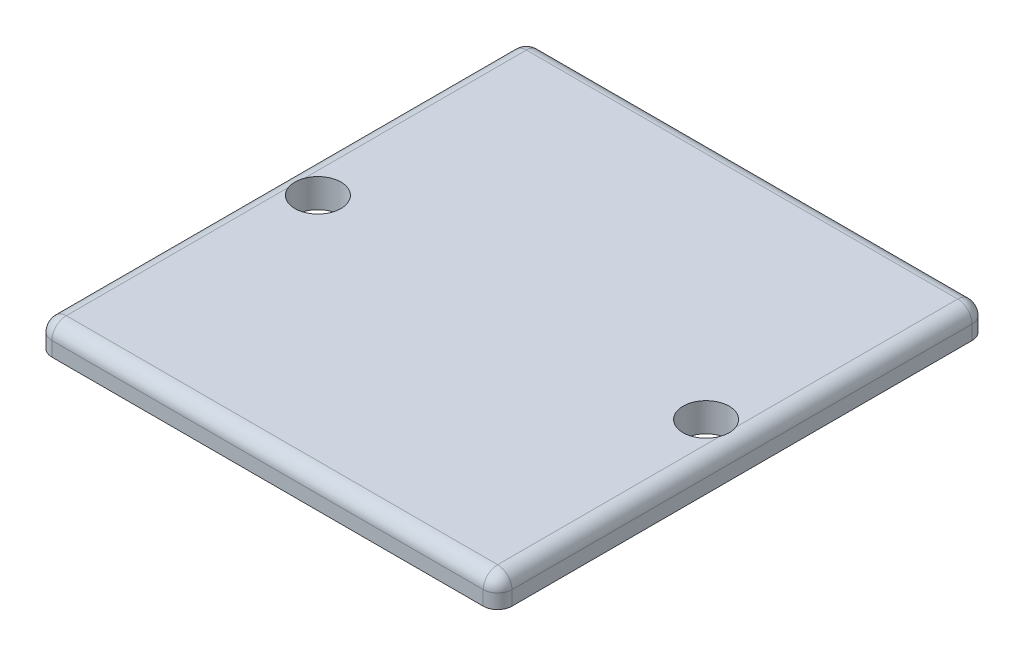
ISO-10303-21;
HEADER;
FILE_DESCRIPTION(('STEP AP214'),'2;1');
FILE_NAME('part.step','',(''),(''),'','','');
FILE_SCHEMA(('AUTOMOTIVE_DESIGN { 1 0 10303 214 1 1 1 1 }'));
ENDSEC;
DATA;
#1=APPLICATION_CONTEXT('core data for automotive mechanical design processes');
#2=APPLICATION_PROTOCOL_DEFINITION('international standard','automotive_design',2000,#1);
#3=PRODUCT_CONTEXT('',#1,'mechanical');
#4=PRODUCT('Part','Part','',(#3));
#5=PRODUCT_RELATED_PRODUCT_CATEGORY('part','',(#4));
#6=PRODUCT_DEFINITION_FORMATION('','',#4);
#7=PRODUCT_DEFINITION_CONTEXT('part definition',#1,'design');
#8=PRODUCT_DEFINITION('design','',#6,#7);
#9=PRODUCT_DEFINITION_SHAPE('','',#8);
#10=(LENGTH_UNIT() NAMED_UNIT(*) SI_UNIT(.MILLI.,.METRE.));
#11=(NAMED_UNIT(*) PLANE_ANGLE_UNIT() SI_UNIT($,.RADIAN.));
#12=(NAMED_UNIT(*) SI_UNIT($,.STERADIAN.) SOLID_ANGLE_UNIT());
#13=UNCERTAINTY_MEASURE_WITH_UNIT(LENGTH_MEASURE(1.E-05),#10,'distance_accuracy_value','');
#14=(GEOMETRIC_REPRESENTATION_CONTEXT(3) GLOBAL_UNCERTAINTY_ASSIGNED_CONTEXT((#13)) GLOBAL_UNIT_ASSIGNED_CONTEXT((#10,
#11,#12)) REPRESENTATION_CONTEXT('',''));
#15=CARTESIAN_POINT('',(0.,0.,0.));
#16=DIRECTION('',(0.,0.,1.));
#17=DIRECTION('',(1.,0.,0.));
#18=AXIS2_PLACEMENT_3D('',#15,#16,#17);
#19=CARTESIAN_POINT('',(0.,2.,0.));
#20=DIRECTION('',(0.,-1.,0.));
#21=DIRECTION('',(0.,0.,-1.));
#22=AXIS2_PLACEMENT_3D('',#19,#20,#21);
#23=PLANE('',#22);
#24=CARTESIAN_POINT('',(13.5,2.,0.));
#25=DIRECTION('',(0.,1.,0.));
#26=DIRECTION('',(0.,0.,-1.));
#27=AXIS2_PLACEMENT_3D('',#24,#25,#26);
#28=CIRCLE('',#27,1.6);
#29=CARTESIAN_POINT('',(15.,2.,-0.556776436283016));
#30=VERTEX_POINT('',#29);
#31=CARTESIAN_POINT('',(15.,2.,0.55677643628301));
#32=VERTEX_POINT('',#31);
#33=EDGE_CURVE('E362',#30,#32,#28,.T.);
#34=ORIENTED_EDGE('',*,*,#33,.F.);
#35=DIRECTION('',(0.,0.,-1.));
#36=VECTOR('',#35,1.);
#37=CARTESIAN_POINT('',(15.,2.,0.));
#38=LINE('',#37,#36);
#39=CARTESIAN_POINT('',(15.,2.,-16.));
#40=VERTEX_POINT('',#39);
#41=EDGE_CURVE('E230',#30,#40,#38,.T.);
#42=ORIENTED_EDGE('',*,*,#41,.T.);
#43=DIRECTION('',(-1.,0.,0.));
#44=VECTOR('',#43,1.);
#45=CARTESIAN_POINT('',(0.,2.,-16.));
#46=LINE('',#45,#44);
#47=CARTESIAN_POINT('',(-15.,2.,-16.));
#48=VERTEX_POINT('',#47);
#49=EDGE_CURVE('E135',#40,#48,#46,.T.);
#50=ORIENTED_EDGE('',*,*,#49,.T.);
#51=DIRECTION('',(0.,0.,1.));
#52=VECTOR('',#51,1.);
#53=CARTESIAN_POINT('',(-15.,2.,0.));
#54=LINE('',#53,#52);
#55=CARTESIAN_POINT('',(-15.,2.,-0.556776436283004));
#56=VERTEX_POINT('',#55);
#57=EDGE_CURVE('E129',#48,#56,#54,.T.);
#58=ORIENTED_EDGE('',*,*,#57,.T.);
#59=CARTESIAN_POINT('',(-13.5,2.,0.));
#60=DIRECTION('',(0.,1.,0.));
#61=DIRECTION('',(0.,0.,1.));
#62=AXIS2_PLACEMENT_3D('',#59,#60,#61);
#63=CIRCLE('',#62,1.6);
#64=CARTESIAN_POINT('',(-15.,2.,0.556776436283004));
#65=VERTEX_POINT('',#64);
#66=EDGE_CURVE('E132',#65,#56,#63,.T.);
#67=ORIENTED_EDGE('',*,*,#66,.F.);
#68=DIRECTION('',(0.,0.,1.));
#69=VECTOR('',#68,1.);
#70=CARTESIAN_POINT('',(-15.,2.,0.));
#71=LINE('',#70,#69);
#72=CARTESIAN_POINT('',(-15.,2.,16.));
#73=VERTEX_POINT('',#72);
#74=EDGE_CURVE('E153',#65,#73,#71,.T.);
#75=ORIENTED_EDGE('',*,*,#74,.T.);
#76=DIRECTION('',(1.,0.,0.));
#77=VECTOR('',#76,1.);
#78=CARTESIAN_POINT('',(0.,2.,16.));
#79=LINE('',#78,#77);
#80=CARTESIAN_POINT('',(15.,2.,16.));
#81=VERTEX_POINT('',#80);
#82=EDGE_CURVE('E377',#73,#81,#79,.T.);
#83=ORIENTED_EDGE('',*,*,#82,.T.);
#84=DIRECTION('',(0.,0.,-1.));
#85=VECTOR('',#84,1.);
#86=CARTESIAN_POINT('',(15.,2.,0.));
#87=LINE('',#86,#85);
#88=EDGE_CURVE('E141',#81,#32,#87,.T.);
#89=ORIENTED_EDGE('',*,*,#88,.T.);
#90=EDGE_LOOP('',(#34,#42,#50,#58,#67,#75,#83,#89));
#91=FACE_BOUND('',#90,.T.);
#92=ADVANCED_FACE('F39',(#91),#23,.F.);
#93=CARTESIAN_POINT('',(0.,0.,0.));
#94=DIRECTION('',(0.,-1.,0.));
#95=DIRECTION('',(0.,0.,-1.));
#96=AXIS2_PLACEMENT_3D('',#93,#94,#95);
#97=PLANE('',#96);
#98=CARTESIAN_POINT('',(-13.5,0.,0.));
#99=DIRECTION('',(0.,1.,0.));
#100=DIRECTION('',(0.,0.,1.));
#101=AXIS2_PLACEMENT_3D('',#98,#99,#100);
#102=CIRCLE('',#101,1.6);
#103=CARTESIAN_POINT('',(-13.5,0.,1.6));
#104=VERTEX_POINT('',#103);
#105=EDGE_CURVE('E149',#104,#104,#102,.T.);
#106=ORIENTED_EDGE('',*,*,#105,.T.);
#107=EDGE_LOOP('',(#106));
#108=FACE_BOUND('',#107,.T.);
#109=DIRECTION('',(0.,0.,1.));
#110=VECTOR('',#109,1.);
#111=CARTESIAN_POINT('',(-16.,0.,17.));
#112=LINE('',#111,#110);
#113=CARTESIAN_POINT('',(-16.,0.,-16.));
#114=VERTEX_POINT('',#113);
#115=CARTESIAN_POINT('',(-16.,0.,16.));
#116=VERTEX_POINT('',#115);
#117=EDGE_CURVE('E275',#114,#116,#112,.T.);
#118=ORIENTED_EDGE('',*,*,#117,.F.);
#119=CARTESIAN_POINT('',(-15.,0.,-16.));
#120=DIRECTION('',(0.,-1.,0.));
#121=DIRECTION('',(0.,0.,-1.));
#122=AXIS2_PLACEMENT_3D('',#119,#120,#121);
#123=CIRCLE('',#122,1.);
#124=CARTESIAN_POINT('',(-15.,0.,-17.));
#125=VERTEX_POINT('',#124);
#126=EDGE_CURVE('E11',#114,#125,#123,.T.);
#127=ORIENTED_EDGE('',*,*,#126,.T.);
#128=DIRECTION('',(-1.,0.,0.));
#129=VECTOR('',#128,1.);
#130=CARTESIAN_POINT('',(-16.,0.,-17.));
#131=LINE('',#130,#129);
#132=CARTESIAN_POINT('',(15.,0.,-17.));
#133=VERTEX_POINT('',#132);
#134=EDGE_CURVE('E267',#133,#125,#131,.T.);
#135=ORIENTED_EDGE('',*,*,#134,.F.);
#136=CARTESIAN_POINT('',(15.,0.,-16.));
#137=DIRECTION('',(0.,-1.,0.));
#138=DIRECTION('',(0.,0.,-1.));
#139=AXIS2_PLACEMENT_3D('',#136,#137,#138);
#140=CIRCLE('',#139,1.);
#141=CARTESIAN_POINT('',(16.,0.,-16.));
#142=VERTEX_POINT('',#141);
#143=EDGE_CURVE('E49',#133,#142,#140,.T.);
#144=ORIENTED_EDGE('',*,*,#143,.T.);
#145=DIRECTION('',(0.,0.,-1.));
#146=VECTOR('',#145,1.);
#147=CARTESIAN_POINT('',(16.,0.,17.));
#148=LINE('',#147,#146);
#149=CARTESIAN_POINT('',(16.,0.,16.));
#150=VERTEX_POINT('',#149);
#151=EDGE_CURVE('E148',#150,#142,#148,.T.);
#152=ORIENTED_EDGE('',*,*,#151,.F.);
#153=CARTESIAN_POINT('',(15.,0.,16.));
#154=DIRECTION('',(0.,-1.,0.));
#155=DIRECTION('',(0.,0.,-1.));
#156=AXIS2_PLACEMENT_3D('',#153,#154,#155);
#157=CIRCLE('',#156,1.);
#158=CARTESIAN_POINT('',(15.,0.,17.));
#159=VERTEX_POINT('',#158);
#160=EDGE_CURVE('E317',#150,#159,#157,.T.);
#161=ORIENTED_EDGE('',*,*,#160,.T.);
#162=DIRECTION('',(1.,0.,0.));
#163=VECTOR('',#162,1.);
#164=CARTESIAN_POINT('',(-16.,0.,17.));
#165=LINE('',#164,#163);
#166=CARTESIAN_POINT('',(-15.,0.,17.));
#167=VERTEX_POINT('',#166);
#168=EDGE_CURVE('E374',#167,#159,#165,.T.);
#169=ORIENTED_EDGE('',*,*,#168,.F.);
#170=CARTESIAN_POINT('',(-15.,0.,16.));
#171=DIRECTION('',(0.,-1.,0.));
#172=DIRECTION('',(0.,0.,-1.));
#173=AXIS2_PLACEMENT_3D('',#170,#171,#172);
#174=CIRCLE('',#173,1.);
#175=EDGE_CURVE('E321',#167,#116,#174,.T.);
#176=ORIENTED_EDGE('',*,*,#175,.T.);
#177=EDGE_LOOP('',(#118,#127,#135,#144,#152,#161,#169,#176));
#178=FACE_BOUND('',#177,.T.);
#179=CARTESIAN_POINT('',(13.5,0.,0.));
#180=DIRECTION('',(0.,1.,0.));
#181=DIRECTION('',(0.,0.,-1.));
#182=AXIS2_PLACEMENT_3D('',#179,#180,#181);
#183=CIRCLE('',#182,1.6);
#184=CARTESIAN_POINT('',(13.5,0.,-1.6));
#185=VERTEX_POINT('',#184);
#186=EDGE_CURVE('E358',#185,#185,#183,.T.);
#187=ORIENTED_EDGE('',*,*,#186,.T.);
#188=EDGE_LOOP('',(#187));
#189=FACE_BOUND('',#188,.T.);
#190=ADVANCED_FACE('F246',(#108,#178,#189),#97,.T.);
#191=CARTESIAN_POINT('',(16.,2.,17.));
#192=DIRECTION('',(-1.,0.,0.));
#193=DIRECTION('',(0.,0.,1.));
#194=AXIS2_PLACEMENT_3D('',#191,#192,#193);
#195=PLANE('',#194);
#196=ORIENTED_EDGE('',*,*,#151,.T.);
#197=DIRECTION('',(0.,-1.,0.));
#198=VECTOR('',#197,1.);
#199=CARTESIAN_POINT('',(16.,2.,-16.));
#200=LINE('',#199,#198);
#201=CARTESIAN_POINT('',(16.,1.,-16.));
#202=VERTEX_POINT('',#201);
#203=EDGE_CURVE('E299',#142,#202,#200,.F.);
#204=ORIENTED_EDGE('',*,*,#203,.T.);
#205=DIRECTION('',(0.,0.,-1.));
#206=VECTOR('',#205,1.);
#207=CARTESIAN_POINT('',(16.,1.,17.));
#208=LINE('',#207,#206);
#209=CARTESIAN_POINT('',(16.,1.,16.));
#210=VERTEX_POINT('',#209);
#211=EDGE_CURVE('E303',#202,#210,#208,.F.);
#212=ORIENTED_EDGE('',*,*,#211,.T.);
#213=DIRECTION('',(0.,-1.,0.));
#214=VECTOR('',#213,1.);
#215=CARTESIAN_POINT('',(16.,2.,16.));
#216=LINE('',#215,#214);
#217=EDGE_CURVE('E229',#210,#150,#216,.T.);
#218=ORIENTED_EDGE('',*,*,#217,.T.);
#219=EDGE_LOOP('',(#196,#204,#212,#218));
#220=FACE_BOUND('',#219,.T.);
#221=ADVANCED_FACE('F218',(#220),#195,.F.);
#222=CARTESIAN_POINT('',(-16.,2.,-17.));
#223=DIRECTION('',(0.,0.,1.));
#224=DIRECTION('',(1.,0.,0.));
#225=AXIS2_PLACEMENT_3D('',#222,#223,#224);
#226=PLANE('',#225);
#227=ORIENTED_EDGE('',*,*,#134,.T.);
#228=DIRECTION('',(0.,-1.,0.));
#229=VECTOR('',#228,1.);
#230=CARTESIAN_POINT('',(-15.,2.,-17.));
#231=LINE('',#230,#229);
#232=CARTESIAN_POINT('',(-15.,1.,-17.));
#233=VERTEX_POINT('',#232);
#234=EDGE_CURVE('E156',#125,#233,#231,.F.);
#235=ORIENTED_EDGE('',*,*,#234,.T.);
#236=DIRECTION('',(-1.,0.,0.));
#237=VECTOR('',#236,1.);
#238=CARTESIAN_POINT('',(-16.,1.,-17.));
#239=LINE('',#238,#237);
#240=CARTESIAN_POINT('',(15.,1.,-17.));
#241=VERTEX_POINT('',#240);
#242=EDGE_CURVE('E162',#233,#241,#239,.F.);
#243=ORIENTED_EDGE('',*,*,#242,.T.);
#244=DIRECTION('',(0.,-1.,0.));
#245=VECTOR('',#244,1.);
#246=CARTESIAN_POINT('',(15.,2.,-17.));
#247=LINE('',#246,#245);
#248=EDGE_CURVE('E271',#241,#133,#247,.T.);
#249=ORIENTED_EDGE('',*,*,#248,.T.);
#250=EDGE_LOOP('',(#227,#235,#243,#249));
#251=FACE_BOUND('',#250,.T.);
#252=ADVANCED_FACE('F257',(#251),#226,.F.);
#253=CARTESIAN_POINT('',(-16.,2.,17.));
#254=DIRECTION('',(1.,0.,0.));
#255=DIRECTION('',(0.,0.,-1.));
#256=AXIS2_PLACEMENT_3D('',#253,#254,#255);
#257=PLANE('',#256);
#258=DIRECTION('',(0.,0.,1.));
#259=VECTOR('',#258,1.);
#260=CARTESIAN_POINT('',(-16.,1.,17.));
#261=LINE('',#260,#259);
#262=CARTESIAN_POINT('',(-16.,1.,16.));
#263=VERTEX_POINT('',#262);
#264=CARTESIAN_POINT('',(-16.,1.,-16.));
#265=VERTEX_POINT('',#264);
#266=EDGE_CURVE('E160',#263,#265,#261,.F.);
#267=ORIENTED_EDGE('',*,*,#266,.T.);
#268=DIRECTION('',(0.,-1.,0.));
#269=VECTOR('',#268,1.);
#270=CARTESIAN_POINT('',(-16.,2.,-16.));
#271=LINE('',#270,#269);
#272=EDGE_CURVE('E282',#265,#114,#271,.T.);
#273=ORIENTED_EDGE('',*,*,#272,.T.);
#274=ORIENTED_EDGE('',*,*,#117,.T.);
#275=DIRECTION('',(0.,-1.,0.));
#276=VECTOR('',#275,1.);
#277=CARTESIAN_POINT('',(-16.,2.,16.));
#278=LINE('',#277,#276);
#279=EDGE_CURVE('E155',#116,#263,#278,.F.);
#280=ORIENTED_EDGE('',*,*,#279,.T.);
#281=EDGE_LOOP('',(#267,#273,#274,#280));
#282=FACE_BOUND('',#281,.T.);
#283=ADVANCED_FACE('F255',(#282),#257,.F.);
#284=CARTESIAN_POINT('',(-16.,2.,17.));
#285=DIRECTION('',(0.,0.,-1.));
#286=DIRECTION('',(-1.,0.,0.));
#287=AXIS2_PLACEMENT_3D('',#284,#285,#286);
#288=PLANE('',#287);
#289=ORIENTED_EDGE('',*,*,#168,.T.);
#290=DIRECTION('',(0.,-1.,0.));
#291=VECTOR('',#290,1.);
#292=CARTESIAN_POINT('',(15.,2.,17.));
#293=LINE('',#292,#291);
#294=CARTESIAN_POINT('',(15.,1.,17.));
#295=VERTEX_POINT('',#294);
#296=EDGE_CURVE('E57',#159,#295,#293,.F.);
#297=ORIENTED_EDGE('',*,*,#296,.T.);
#298=DIRECTION('',(1.,0.,0.));
#299=VECTOR('',#298,1.);
#300=CARTESIAN_POINT('',(-16.,1.,17.));
#301=LINE('',#300,#299);
#302=CARTESIAN_POINT('',(-15.,1.,17.));
#303=VERTEX_POINT('',#302);
#304=EDGE_CURVE('E61',#295,#303,#301,.F.);
#305=ORIENTED_EDGE('',*,*,#304,.T.);
#306=DIRECTION('',(0.,-1.,0.));
#307=VECTOR('',#306,1.);
#308=CARTESIAN_POINT('',(-15.,2.,17.));
#309=LINE('',#308,#307);
#310=EDGE_CURVE('E394',#303,#167,#309,.T.);
#311=ORIENTED_EDGE('',*,*,#310,.T.);
#312=EDGE_LOOP('',(#289,#297,#305,#311));
#313=FACE_BOUND('',#312,.T.);
#314=ADVANCED_FACE('F242',(#313),#288,.F.);
#315=CARTESIAN_POINT('',(-13.5,2.,0.));
#316=DIRECTION('',(0.,-1.,0.));
#317=DIRECTION('',(0.,0.,-1.));
#318=AXIS2_PLACEMENT_3D('',#315,#316,#317);
#319=CYLINDRICAL_SURFACE('',#318,1.6);
#320=ORIENTED_EDGE('',*,*,#66,.T.);
#321=CARTESIAN_POINT('',(-15.,2.,-0.556776436283004));
#322=CARTESIAN_POINT('',(-15.0147391055554,1.99998496745091,-0.517078477432242));
#323=CARTESIAN_POINT('',(-15.0278943767572,1.99967353177831,-0.47679624391326));
#324=CARTESIAN_POINT('',(-15.0509713450384,1.99877091354686,-0.395319497997584));
#325=CARTESIAN_POINT('',(-15.060893109917,1.99817973685417,-0.354125004748207));
#326=CARTESIAN_POINT('',(-15.0774516887611,1.99702970332047,-0.271008526878196));
#327=CARTESIAN_POINT('',(-15.0840829530123,1.99647090247629,-0.22908543580798));
#328=CARTESIAN_POINT('',(-15.0939945861068,1.99558541974185,-0.144843909600387));
#329=CARTESIAN_POINT('',(-15.0972750411779,1.99525873187858,-0.102525484664596));
#330=CARTESIAN_POINT('',(-15.1005598224054,1.99493256521579,-0.0151976513167372));
#331=CARTESIAN_POINT('',(-15.1003542558848,1.99495404633261,0.0298198772089434));
#332=CARTESIAN_POINT('',(-15.0961506996098,1.99536899343583,0.119699586509041));
#333=CARTESIAN_POINT('',(-15.0921506855074,1.99576265798271,0.16456167153083));
#334=CARTESIAN_POINT('',(-15.0804019184843,1.9967798384245,0.253660743085475));
#335=CARTESIAN_POINT('',(-15.0726635739649,1.99740271499809,0.297899116289918));
#336=CARTESIAN_POINT('',(-15.0534963082465,1.99861424001894,0.385565872890392));
#337=CARTESIAN_POINT('',(-15.0420683406369,1.99920289726391,0.428994462512046));
#338=CARTESIAN_POINT('',(-15.0244296937916,1.99971111322623,0.486146203287061));
#339=CARTESIAN_POINT('',(-15.0198186839963,1.99981512644983,0.500374860267172));
#340=CARTESIAN_POINT('',(-15.0102037884615,1.99995952394309,0.528684815779251));
#341=CARTESIAN_POINT('',(-15.0052002606416,1.99999996548887,0.542766235589541));
#342=CARTESIAN_POINT('',(-15.,2.,0.556776436283004));
#343=B_SPLINE_CURVE_WITH_KNOTS('',3,(#321,#322,#323,#324,#325,#326,#327,#328,#329,#330,#331,
#332,#333,#334,#335,#336,#337,#338,#339,#340,#341,#342),.UNSPECIFIED.,.F.,.F.,(4,2,2,2,2,2,2,2,
2,2,4),(0.,0.126998583234678,0.253994503431989,0.381203891347207,0.508410005643236,
0.643300992568259,0.778263984695445,0.912853354704603,1.04740796766765,1.09227609232237,
1.13710376897364),.UNSPECIFIED.);
#344=EDGE_CURVE('E146',#56,#65,#343,.T.);
#345=ORIENTED_EDGE('',*,*,#344,.T.);
#346=EDGE_LOOP('',(#320,#345));
#347=FACE_BOUND('',#346,.T.);
#348=ORIENTED_EDGE('',*,*,#105,.F.);
#349=EDGE_LOOP('',(#348));
#350=FACE_BOUND('',#349,.T.);
#351=ADVANCED_FACE('F144',(#347,#350),#319,.F.);
#352=CARTESIAN_POINT('',(13.5,2.,0.));
#353=DIRECTION('',(0.,-1.,0.));
#354=DIRECTION('',(0.,0.,-1.));
#355=AXIS2_PLACEMENT_3D('',#352,#353,#354);
#356=CYLINDRICAL_SURFACE('',#355,1.6);
#357=ORIENTED_EDGE('',*,*,#33,.T.);
#358=CARTESIAN_POINT('',(15.,2.,0.55677643628301));
#359=CARTESIAN_POINT('',(15.0147391055554,1.99998496745091,0.517078477432248));
#360=CARTESIAN_POINT('',(15.0278943767572,1.99967353177831,0.476796243913266));
#361=CARTESIAN_POINT('',(15.0509713450384,1.99877091354686,0.395319497997591));
#362=CARTESIAN_POINT('',(15.060893109917,1.99817973685417,0.354125004748214));
#363=CARTESIAN_POINT('',(15.0774516887611,1.99702970332047,0.271008526878202));
#364=CARTESIAN_POINT('',(15.0840829530123,1.99647090247629,0.229085435807987));
#365=CARTESIAN_POINT('',(15.0939945861068,1.99558541974185,0.144843909600393));
#366=CARTESIAN_POINT('',(15.0972750411779,1.99525873187858,0.102525484664602));
#367=CARTESIAN_POINT('',(15.1005598224054,1.99493256521579,0.0151976513167433));
#368=CARTESIAN_POINT('',(15.1003542558848,1.99495404633261,-0.0298198772089373));
#369=CARTESIAN_POINT('',(15.0961506996098,1.99536899343583,-0.119699586509035));
#370=CARTESIAN_POINT('',(15.0921506855074,1.99576265798271,-0.164561671530824));
#371=CARTESIAN_POINT('',(15.0804019184843,1.9967798384245,-0.253660743085469));
#372=CARTESIAN_POINT('',(15.0726635739649,1.99740271499809,-0.297899116289912));
#373=CARTESIAN_POINT('',(15.0534963082465,1.99861424001894,-0.385565872890386));
#374=CARTESIAN_POINT('',(15.0420683406369,1.99920289726391,-0.42899446251204));
#375=CARTESIAN_POINT('',(15.0244296937916,1.99971111322623,-0.486146203287058));
#376=CARTESIAN_POINT('',(15.0198186839963,1.99981512644983,-0.500374860267173));
#377=CARTESIAN_POINT('',(15.0102037884615,1.99995952394309,-0.528684815779257));
#378=CARTESIAN_POINT('',(15.0052002606416,1.99999996548887,-0.54276623558955));
#379=CARTESIAN_POINT('',(15.,2.,-0.556776436283017));
#380=B_SPLINE_CURVE_WITH_KNOTS('',3,(#358,#359,#360,#361,#362,#363,#364,#365,#366,#367,#368,
#369,#370,#371,#372,#373,#374,#375,#376,#377,#378,#379),.UNSPECIFIED.,.F.,.F.,(4,2,2,2,2,2,2,2,
2,2,4),(0.,0.126998583234678,0.253994503431989,0.381203891347207,0.508410005643236,
0.643300992568259,0.778263984695446,0.912853354704603,1.04740796766765,1.09227609232238,
1.13710376897366),.UNSPECIFIED.);
#381=EDGE_CURVE('E221',#32,#30,#380,.T.);
#382=ORIENTED_EDGE('',*,*,#381,.T.);
#383=EDGE_LOOP('',(#357,#382));
#384=FACE_BOUND('',#383,.T.);
#385=ORIENTED_EDGE('',*,*,#186,.F.);
#386=EDGE_LOOP('',(#385));
#387=FACE_BOUND('',#386,.T.);
#388=ADVANCED_FACE('F233',(#384,#387),#356,.F.);
#389=CARTESIAN_POINT('',(-15.,2.,16.));
#390=DIRECTION('',(0.,-1.,0.));
#391=DIRECTION('',(0.,0.,-1.));
#392=AXIS2_PLACEMENT_3D('',#389,#390,#391);
#393=CYLINDRICAL_SURFACE('',#392,1.);
#394=ORIENTED_EDGE('',*,*,#175,.F.);
#395=ORIENTED_EDGE('',*,*,#310,.F.);
#396=CARTESIAN_POINT('',(-15.,1.,16.));
#397=DIRECTION('',(0.,1.,0.));
#398=DIRECTION('',(0.,0.,1.));
#399=AXIS2_PLACEMENT_3D('',#396,#397,#398);
#400=CIRCLE('',#399,1.);
#401=EDGE_CURVE('E43',#263,#303,#400,.T.);
#402=ORIENTED_EDGE('',*,*,#401,.F.);
#403=ORIENTED_EDGE('',*,*,#279,.F.);
#404=EDGE_LOOP('',(#394,#395,#402,#403));
#405=FACE_BOUND('',#404,.T.);
#406=ADVANCED_FACE('F41',(#405),#393,.T.);
#407=CARTESIAN_POINT('',(-15.,1.,0.));
#408=DIRECTION('',(0.,0.,1.));
#409=DIRECTION('',(1.,0.,0.));
#410=AXIS2_PLACEMENT_3D('',#407,#408,#409);
#411=CYLINDRICAL_SURFACE('',#410,1.);
#412=CARTESIAN_POINT('',(-15.,1.,-16.));
#413=DIRECTION('',(0.,0.,-1.));
#414=DIRECTION('',(-1.,0.,0.));
#415=AXIS2_PLACEMENT_3D('',#412,#413,#414);
#416=CIRCLE('',#415,1.);
#417=EDGE_CURVE('E284',#265,#48,#416,.T.);
#418=ORIENTED_EDGE('',*,*,#417,.F.);
#419=ORIENTED_EDGE('',*,*,#266,.F.);
#420=CARTESIAN_POINT('',(-15.,1.,16.));
#421=DIRECTION('',(0.,0.,1.));
#422=DIRECTION('',(1.,0.,0.));
#423=AXIS2_PLACEMENT_3D('',#420,#421,#422);
#424=CIRCLE('',#423,1.);
#425=EDGE_CURVE('E352',#73,#263,#424,.T.);
#426=ORIENTED_EDGE('',*,*,#425,.F.);
#427=ORIENTED_EDGE('',*,*,#74,.F.);
#428=ORIENTED_EDGE('',*,*,#344,.F.);
#429=ORIENTED_EDGE('',*,*,#57,.F.);
#430=EDGE_LOOP('',(#418,#419,#426,#427,#428,#429));
#431=FACE_BOUND('',#430,.T.);
#432=ADVANCED_FACE('F151',(#431),#411,.T.);
#433=CARTESIAN_POINT('',(-15.,2.,-16.));
#434=DIRECTION('',(0.,-1.,0.));
#435=DIRECTION('',(0.,0.,-1.));
#436=AXIS2_PLACEMENT_3D('',#433,#434,#435);
#437=CYLINDRICAL_SURFACE('',#436,1.);
#438=ORIENTED_EDGE('',*,*,#126,.F.);
#439=ORIENTED_EDGE('',*,*,#272,.F.);
#440=CARTESIAN_POINT('',(-15.,1.,-16.));
#441=DIRECTION('',(0.,1.,0.));
#442=DIRECTION('',(0.,0.,1.));
#443=AXIS2_PLACEMENT_3D('',#440,#441,#442);
#444=CIRCLE('',#443,1.);
#445=EDGE_CURVE('E280',#233,#265,#444,.T.);
#446=ORIENTED_EDGE('',*,*,#445,.F.);
#447=ORIENTED_EDGE('',*,*,#234,.F.);
#448=EDGE_LOOP('',(#438,#439,#446,#447));
#449=FACE_BOUND('',#448,.T.);
#450=ADVANCED_FACE('F177',(#449),#437,.T.);
#451=CARTESIAN_POINT('',(-15.,1.,16.));
#452=DIRECTION('',(-1.,0.,0.));
#453=DIRECTION('',(0.,0.,1.));
#454=AXIS2_PLACEMENT_3D('',#451,#452,#453);
#455=SPHERICAL_SURFACE('',#454,1.);
#456=ORIENTED_EDGE('',*,*,#425,.T.);
#457=ORIENTED_EDGE('',*,*,#401,.T.);
#458=CARTESIAN_POINT('',(-15.,1.,16.));
#459=DIRECTION('',(-1.,0.,0.));
#460=DIRECTION('',(0.,0.,1.));
#461=AXIS2_PLACEMENT_3D('',#458,#459,#460);
#462=CIRCLE('',#461,1.);
#463=EDGE_CURVE('E285',#73,#303,#462,.F.);
#464=ORIENTED_EDGE('',*,*,#463,.F.);
#465=EDGE_LOOP('',(#456,#457,#464));
#466=FACE_BOUND('',#465,.T.);
#467=ADVANCED_FACE('F180',(#466),#455,.T.);
#468=CARTESIAN_POINT('',(-15.,1.,-16.));
#469=DIRECTION('',(-1.,0.,0.));
#470=DIRECTION('',(0.,0.,1.));
#471=AXIS2_PLACEMENT_3D('',#468,#469,#470);
#472=SPHERICAL_SURFACE('',#471,1.);
#473=ORIENTED_EDGE('',*,*,#445,.T.);
#474=ORIENTED_EDGE('',*,*,#417,.T.);
#475=CARTESIAN_POINT('',(-15.,1.,-16.));
#476=DIRECTION('',(-1.,0.,0.));
#477=DIRECTION('',(0.,0.,1.));
#478=AXIS2_PLACEMENT_3D('',#475,#476,#477);
#479=CIRCLE('',#478,1.);
#480=EDGE_CURVE('E288',#233,#48,#479,.F.);
#481=ORIENTED_EDGE('',*,*,#480,.F.);
#482=EDGE_LOOP('',(#473,#474,#481));
#483=FACE_BOUND('',#482,.T.);
#484=ADVANCED_FACE('F184',(#483),#472,.T.);
#485=CARTESIAN_POINT('',(15.,2.,16.));
#486=DIRECTION('',(0.,-1.,0.));
#487=DIRECTION('',(0.,0.,-1.));
#488=AXIS2_PLACEMENT_3D('',#485,#486,#487);
#489=CYLINDRICAL_SURFACE('',#488,1.);
#490=ORIENTED_EDGE('',*,*,#160,.F.);
#491=ORIENTED_EDGE('',*,*,#217,.F.);
#492=CARTESIAN_POINT('',(15.,1.,16.));
#493=DIRECTION('',(0.,1.,0.));
#494=DIRECTION('',(0.,0.,1.));
#495=AXIS2_PLACEMENT_3D('',#492,#493,#494);
#496=CIRCLE('',#495,1.);
#497=EDGE_CURVE('E291',#295,#210,#496,.T.);
#498=ORIENTED_EDGE('',*,*,#497,.F.);
#499=ORIENTED_EDGE('',*,*,#296,.F.);
#500=EDGE_LOOP('',(#490,#491,#498,#499));
#501=FACE_BOUND('',#500,.T.);
#502=ADVANCED_FACE('F188',(#501),#489,.T.);
#503=CARTESIAN_POINT('',(0.,1.,16.));
#504=DIRECTION('',(1.,0.,0.));
#505=DIRECTION('',(0.,0.,-1.));
#506=AXIS2_PLACEMENT_3D('',#503,#504,#505);
#507=CYLINDRICAL_SURFACE('',#506,1.);
#508=ORIENTED_EDGE('',*,*,#463,.T.);
#509=ORIENTED_EDGE('',*,*,#304,.F.);
#510=CARTESIAN_POINT('',(15.,1.,16.));
#511=DIRECTION('',(1.,0.,0.));
#512=DIRECTION('',(0.,0.,-1.));
#513=AXIS2_PLACEMENT_3D('',#510,#511,#512);
#514=CIRCLE('',#513,1.);
#515=EDGE_CURVE('E341',#81,#295,#514,.T.);
#516=ORIENTED_EDGE('',*,*,#515,.F.);
#517=ORIENTED_EDGE('',*,*,#82,.F.);
#518=EDGE_LOOP('',(#508,#509,#516,#517));
#519=FACE_BOUND('',#518,.T.);
#520=ADVANCED_FACE('F192',(#519),#507,.T.);
#521=CARTESIAN_POINT('',(0.,1.,-16.));
#522=DIRECTION('',(-1.,0.,0.));
#523=DIRECTION('',(0.,0.,1.));
#524=AXIS2_PLACEMENT_3D('',#521,#522,#523);
#525=CYLINDRICAL_SURFACE('',#524,1.);
#526=ORIENTED_EDGE('',*,*,#480,.T.);
#527=ORIENTED_EDGE('',*,*,#49,.F.);
#528=CARTESIAN_POINT('',(15.,1.,-16.));
#529=DIRECTION('',(1.,0.,0.));
#530=DIRECTION('',(0.,0.,-1.));
#531=AXIS2_PLACEMENT_3D('',#528,#529,#530);
#532=CIRCLE('',#531,1.);
#533=EDGE_CURVE('E295',#241,#40,#532,.T.);
#534=ORIENTED_EDGE('',*,*,#533,.F.);
#535=ORIENTED_EDGE('',*,*,#242,.F.);
#536=EDGE_LOOP('',(#526,#527,#534,#535));
#537=FACE_BOUND('',#536,.T.);
#538=ADVANCED_FACE('F196',(#537),#525,.T.);
#539=CARTESIAN_POINT('',(15.,2.,-16.));
#540=DIRECTION('',(0.,-1.,0.));
#541=DIRECTION('',(0.,0.,-1.));
#542=AXIS2_PLACEMENT_3D('',#539,#540,#541);
#543=CYLINDRICAL_SURFACE('',#542,1.);
#544=ORIENTED_EDGE('',*,*,#143,.F.);
#545=ORIENTED_EDGE('',*,*,#248,.F.);
#546=CARTESIAN_POINT('',(15.,1.,-16.));
#547=DIRECTION('',(0.,1.,0.));
#548=DIRECTION('',(0.,0.,1.));
#549=AXIS2_PLACEMENT_3D('',#546,#547,#548);
#550=CIRCLE('',#549,1.);
#551=EDGE_CURVE('E336',#202,#241,#550,.T.);
#552=ORIENTED_EDGE('',*,*,#551,.F.);
#553=ORIENTED_EDGE('',*,*,#203,.F.);
#554=EDGE_LOOP('',(#544,#545,#552,#553));
#555=FACE_BOUND('',#554,.T.);
#556=ADVANCED_FACE('F200',(#555),#543,.T.);
#557=CARTESIAN_POINT('',(15.,1.,16.));
#558=DIRECTION('',(0.,0.,1.));
#559=DIRECTION('',(1.,0.,0.));
#560=AXIS2_PLACEMENT_3D('',#557,#558,#559);
#561=SPHERICAL_SURFACE('',#560,1.);
#562=ORIENTED_EDGE('',*,*,#515,.T.);
#563=ORIENTED_EDGE('',*,*,#497,.T.);
#564=CARTESIAN_POINT('',(15.,1.,16.));
#565=DIRECTION('',(0.,0.,1.));
#566=DIRECTION('',(1.,0.,0.));
#567=AXIS2_PLACEMENT_3D('',#564,#565,#566);
#568=CIRCLE('',#567,1.);
#569=EDGE_CURVE('E333',#81,#210,#568,.F.);
#570=ORIENTED_EDGE('',*,*,#569,.F.);
#571=EDGE_LOOP('',(#562,#563,#570));
#572=FACE_BOUND('',#571,.T.);
#573=ADVANCED_FACE('F204',(#572),#561,.T.);
#574=CARTESIAN_POINT('',(15.,1.,-16.));
#575=DIRECTION('',(0.,0.,-1.));
#576=DIRECTION('',(-1.,0.,0.));
#577=AXIS2_PLACEMENT_3D('',#574,#575,#576);
#578=SPHERICAL_SURFACE('',#577,1.);
#579=ORIENTED_EDGE('',*,*,#551,.T.);
#580=ORIENTED_EDGE('',*,*,#533,.T.);
#581=CARTESIAN_POINT('',(15.,1.,-16.));
#582=DIRECTION('',(0.,0.,-1.));
#583=DIRECTION('',(-1.,0.,0.));
#584=AXIS2_PLACEMENT_3D('',#581,#582,#583);
#585=CIRCLE('',#584,1.);
#586=EDGE_CURVE('E329',#202,#40,#585,.F.);
#587=ORIENTED_EDGE('',*,*,#586,.F.);
#588=EDGE_LOOP('',(#579,#580,#587));
#589=FACE_BOUND('',#588,.T.);
#590=ADVANCED_FACE('F208',(#589),#578,.T.);
#591=CARTESIAN_POINT('',(15.,1.,0.));
#592=DIRECTION('',(0.,0.,-1.));
#593=DIRECTION('',(-1.,0.,0.));
#594=AXIS2_PLACEMENT_3D('',#591,#592,#593);
#595=CYLINDRICAL_SURFACE('',#594,1.);
#596=ORIENTED_EDGE('',*,*,#569,.T.);
#597=ORIENTED_EDGE('',*,*,#211,.F.);
#598=ORIENTED_EDGE('',*,*,#586,.T.);
#599=ORIENTED_EDGE('',*,*,#41,.F.);
#600=ORIENTED_EDGE('',*,*,#381,.F.);
#601=ORIENTED_EDGE('',*,*,#88,.F.);
#602=EDGE_LOOP('',(#596,#597,#598,#599,#600,#601));
#603=FACE_BOUND('',#602,.T.);
#604=ADVANCED_FACE('F212',(#603),#595,.T.);
#605=CLOSED_SHELL('',(#92,#190,#221,#252,#283,#314,#351,#388,#406,#432,#450,#467,#484,#502,#520,
#538,#556,#573,#590,#604));
#606=MANIFOLD_SOLID_BREP('B2',#605);
#607=ADVANCED_BREP_SHAPE_REPRESENTATION('',(#18,#606),#14);
#608=SHAPE_DEFINITION_REPRESENTATION(#9,#607);
ENDSEC;
END-ISO-10303-21;
